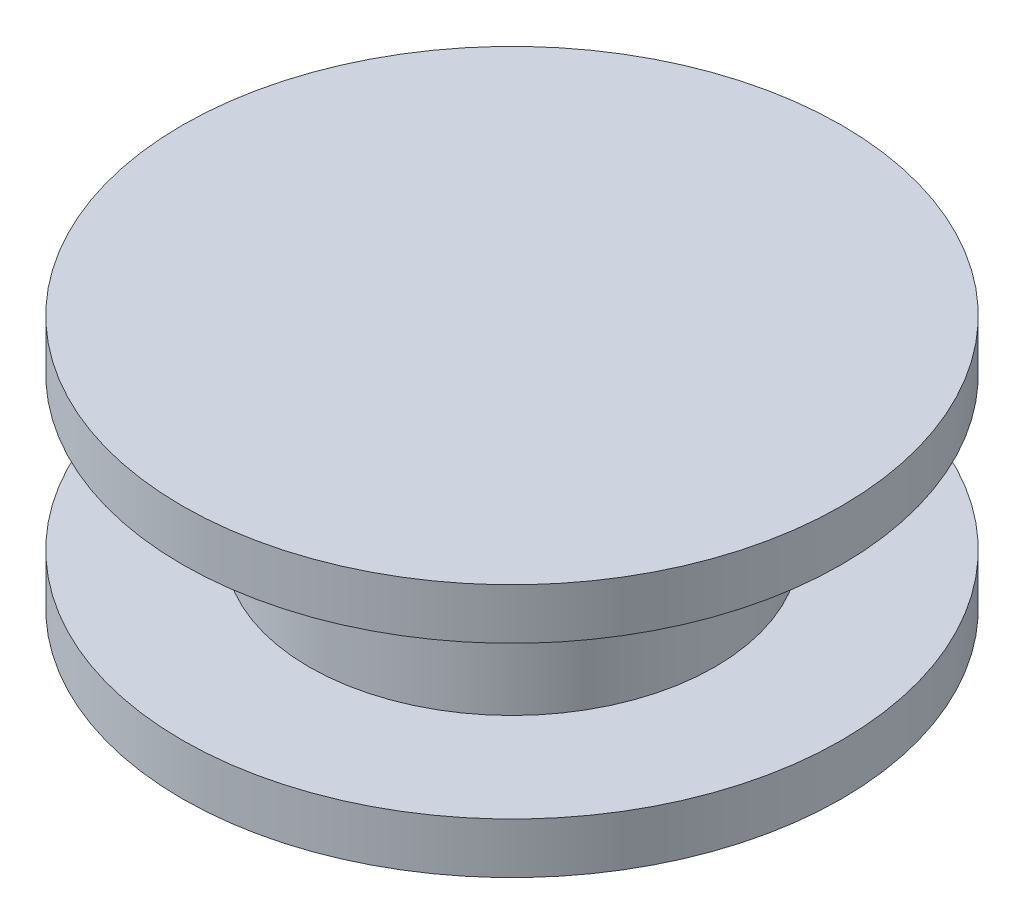
ISO-10303-21;
HEADER;
FILE_DESCRIPTION(('STEP AP214'),'2;1');
FILE_NAME('part.step','',(''),(''),'','','');
FILE_SCHEMA(('AUTOMOTIVE_DESIGN { 1 0 10303 214 1 1 1 1 }'));
ENDSEC;
DATA;
#1=APPLICATION_CONTEXT('core data for automotive mechanical design processes');
#2=APPLICATION_PROTOCOL_DEFINITION('international standard','automotive_design',2000,#1);
#3=PRODUCT_CONTEXT('',#1,'mechanical');
#4=PRODUCT('Part','Part','',(#3));
#5=PRODUCT_RELATED_PRODUCT_CATEGORY('part','',(#4));
#6=PRODUCT_DEFINITION_FORMATION('','',#4);
#7=PRODUCT_DEFINITION_CONTEXT('part definition',#1,'design');
#8=PRODUCT_DEFINITION('design','',#6,#7);
#9=PRODUCT_DEFINITION_SHAPE('','',#8);
#10=(LENGTH_UNIT() NAMED_UNIT(*) SI_UNIT(.MILLI.,.METRE.));
#11=(NAMED_UNIT(*) PLANE_ANGLE_UNIT() SI_UNIT($,.RADIAN.));
#12=(NAMED_UNIT(*) SI_UNIT($,.STERADIAN.) SOLID_ANGLE_UNIT());
#13=UNCERTAINTY_MEASURE_WITH_UNIT(LENGTH_MEASURE(1.E-05),#10,'distance_accuracy_value','');
#14=(GEOMETRIC_REPRESENTATION_CONTEXT(3) GLOBAL_UNCERTAINTY_ASSIGNED_CONTEXT((#13)) GLOBAL_UNIT_ASSIGNED_CONTEXT((#10,
#11,#12)) REPRESENTATION_CONTEXT('',''));
#15=CARTESIAN_POINT('',(0.,0.,0.));
#16=DIRECTION('',(0.,0.,1.));
#17=DIRECTION('',(1.,0.,0.));
#18=AXIS2_PLACEMENT_3D('',#15,#16,#17);
#19=CARTESIAN_POINT('',(0.,10.,0.));
#20=DIRECTION('',(0.,-1.,0.));
#21=DIRECTION('',(0.,0.,-1.));
#22=AXIS2_PLACEMENT_3D('',#19,#20,#21);
#23=CYLINDRICAL_SURFACE('',#22,20.);
#24=CARTESIAN_POINT('',(0.,-5.,0.));
#25=DIRECTION('',(0.,1.,0.));
#26=DIRECTION('',(0.,0.,1.));
#27=AXIS2_PLACEMENT_3D('',#24,#25,#26);
#28=CIRCLE('',#27,20.);
#29=CARTESIAN_POINT('',(0.,-5.,20.));
#30=VERTEX_POINT('',#29);
#31=EDGE_CURVE('E40',#30,#30,#28,.T.);
#32=ORIENTED_EDGE('',*,*,#31,.T.);
#33=EDGE_LOOP('',(#32));
#34=FACE_BOUND('',#33,.T.);
#35=CARTESIAN_POINT('',(0.,10.,0.));
#36=DIRECTION('',(0.,1.,0.));
#37=DIRECTION('',(0.,0.,1.));
#38=AXIS2_PLACEMENT_3D('',#35,#36,#37);
#39=CIRCLE('',#38,20.);
#40=CARTESIAN_POINT('',(0.,10.,20.));
#41=VERTEX_POINT('',#40);
#42=EDGE_CURVE('E10',#41,#41,#39,.T.);
#43=ORIENTED_EDGE('',*,*,#42,.F.);
#44=EDGE_LOOP('',(#43));
#45=FACE_BOUND('',#44,.T.);
#46=ADVANCED_FACE('F37',(#34,#45),#23,.T.);
#47=CARTESIAN_POINT('',(0.,15.,0.));
#48=DIRECTION('',(0.,-1.,0.));
#49=DIRECTION('',(0.,0.,-1.));
#50=AXIS2_PLACEMENT_3D('',#47,#48,#49);
#51=CYLINDRICAL_SURFACE('',#50,32.5);
#52=CARTESIAN_POINT('',(0.,15.,0.));
#53=DIRECTION('',(0.,1.,0.));
#54=DIRECTION('',(0.,0.,1.));
#55=AXIS2_PLACEMENT_3D('',#52,#53,#54);
#56=CIRCLE('',#55,32.5);
#57=CARTESIAN_POINT('',(0.,15.,32.5));
#58=VERTEX_POINT('',#57);
#59=EDGE_CURVE('E45',#58,#58,#56,.T.);
#60=ORIENTED_EDGE('',*,*,#59,.F.);
#61=EDGE_LOOP('',(#60));
#62=FACE_BOUND('',#61,.T.);
#63=CARTESIAN_POINT('',(0.,10.,0.));
#64=DIRECTION('',(0.,1.,0.));
#65=DIRECTION('',(0.,0.,1.));
#66=AXIS2_PLACEMENT_3D('',#63,#64,#65);
#67=CIRCLE('',#66,32.5);
#68=CARTESIAN_POINT('',(0.,10.,32.5));
#69=VERTEX_POINT('',#68);
#70=EDGE_CURVE('E50',#69,#69,#67,.T.);
#71=ORIENTED_EDGE('',*,*,#70,.T.);
#72=EDGE_LOOP('',(#71));
#73=FACE_BOUND('',#72,.T.);
#74=ADVANCED_FACE('F85',(#62,#73),#51,.T.);
#75=CARTESIAN_POINT('',(0.,15.,0.));
#76=DIRECTION('',(0.,1.,0.));
#77=DIRECTION('',(0.,0.,1.));
#78=AXIS2_PLACEMENT_3D('',#75,#76,#77);
#79=PLANE('',#78);
#80=ORIENTED_EDGE('',*,*,#59,.T.);
#81=EDGE_LOOP('',(#80));
#82=FACE_BOUND('',#81,.T.);
#83=ADVANCED_FACE('F89',(#82),#79,.T.);
#84=CARTESIAN_POINT('',(0.,10.,0.));
#85=DIRECTION('',(0.,1.,0.));
#86=DIRECTION('',(0.,0.,1.));
#87=AXIS2_PLACEMENT_3D('',#84,#85,#86);
#88=PLANE('',#87);
#89=ORIENTED_EDGE('',*,*,#42,.T.);
#90=EDGE_LOOP('',(#89));
#91=FACE_BOUND('',#90,.T.);
#92=ORIENTED_EDGE('',*,*,#70,.F.);
#93=EDGE_LOOP('',(#92));
#94=FACE_BOUND('',#93,.T.);
#95=ADVANCED_FACE('F81',(#91,#94),#88,.F.);
#96=CARTESIAN_POINT('',(0.,-5.,0.));
#97=DIRECTION('',(0.,-1.,0.));
#98=DIRECTION('',(0.,0.,-1.));
#99=AXIS2_PLACEMENT_3D('',#96,#97,#98);
#100=CYLINDRICAL_SURFACE('',#99,32.5);
#101=CARTESIAN_POINT('',(0.,-5.,0.));
#102=DIRECTION('',(0.,1.,0.));
#103=DIRECTION('',(0.,0.,1.));
#104=AXIS2_PLACEMENT_3D('',#101,#102,#103);
#105=CIRCLE('',#104,32.5);
#106=CARTESIAN_POINT('',(0.,-5.,32.5));
#107=VERTEX_POINT('',#106);
#108=EDGE_CURVE('E60',#107,#107,#105,.T.);
#109=ORIENTED_EDGE('',*,*,#108,.F.);
#110=EDGE_LOOP('',(#109));
#111=FACE_BOUND('',#110,.T.);
#112=CARTESIAN_POINT('',(0.,-10.,0.));
#113=DIRECTION('',(0.,1.,0.));
#114=DIRECTION('',(0.,0.,1.));
#115=AXIS2_PLACEMENT_3D('',#112,#113,#114);
#116=CIRCLE('',#115,32.5);
#117=CARTESIAN_POINT('',(0.,-10.,32.5));
#118=VERTEX_POINT('',#117);
#119=EDGE_CURVE('E56',#118,#118,#116,.T.);
#120=ORIENTED_EDGE('',*,*,#119,.T.);
#121=EDGE_LOOP('',(#120));
#122=FACE_BOUND('',#121,.T.);
#123=ADVANCED_FACE('F74',(#111,#122),#100,.T.);
#124=CARTESIAN_POINT('',(0.,-5.,0.));
#125=DIRECTION('',(0.,1.,0.));
#126=DIRECTION('',(0.,0.,1.));
#127=AXIS2_PLACEMENT_3D('',#124,#125,#126);
#128=PLANE('',#127);
#129=ORIENTED_EDGE('',*,*,#31,.F.);
#130=EDGE_LOOP('',(#129));
#131=FACE_BOUND('',#130,.T.);
#132=ORIENTED_EDGE('',*,*,#108,.T.);
#133=EDGE_LOOP('',(#132));
#134=FACE_BOUND('',#133,.T.);
#135=ADVANCED_FACE('F71',(#131,#134),#128,.T.);
#136=CARTESIAN_POINT('',(0.,-10.,0.));
#137=DIRECTION('',(0.,1.,0.));
#138=DIRECTION('',(0.,0.,1.));
#139=AXIS2_PLACEMENT_3D('',#136,#137,#138);
#140=PLANE('',#139);
#141=ORIENTED_EDGE('',*,*,#119,.F.);
#142=EDGE_LOOP('',(#141));
#143=FACE_BOUND('',#142,.T.);
#144=ADVANCED_FACE('F73',(#143),#140,.F.);
#145=CLOSED_SHELL('',(#46,#74,#83,#95,#123,#135,#144));
#146=MANIFOLD_SOLID_BREP('B2',#145);
#147=ADVANCED_BREP_SHAPE_REPRESENTATION('',(#18,#146),#14);
#148=SHAPE_DEFINITION_REPRESENTATION(#9,#147);
ENDSEC;
END-ISO-10303-21;
